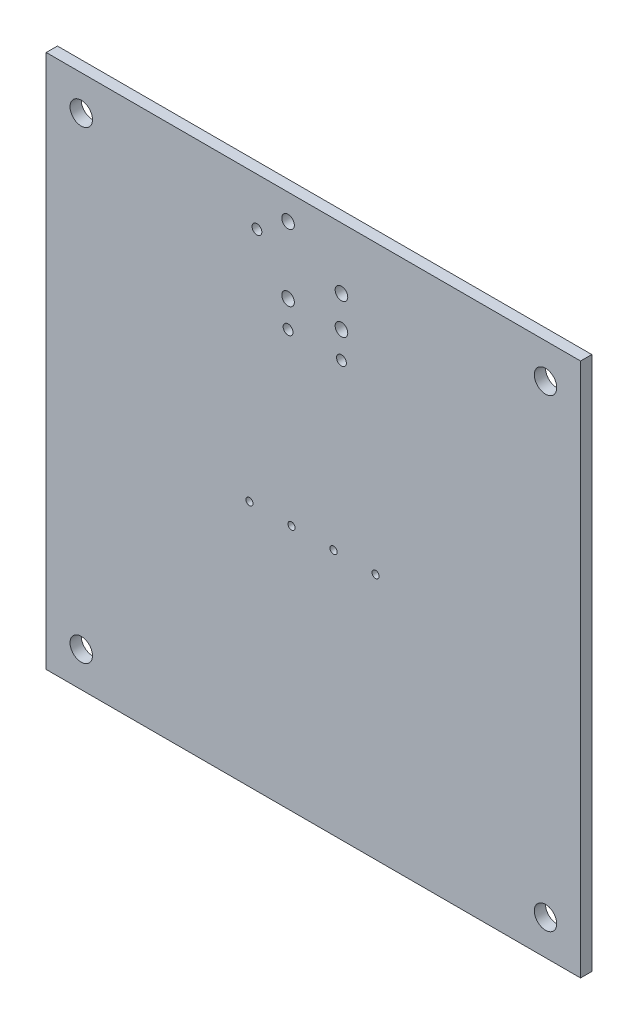
ISO-10303-21;
HEADER;
FILE_DESCRIPTION(('STEP AP214'),'2;1');
FILE_NAME('part.step','',(''),(''),'','','');
FILE_SCHEMA(('AUTOMOTIVE_DESIGN { 1 0 10303 214 1 1 1 1 }'));
ENDSEC;
DATA;
#1=APPLICATION_CONTEXT('core data for automotive mechanical design processes');
#2=APPLICATION_PROTOCOL_DEFINITION('international standard','automotive_design',2000,#1);
#3=PRODUCT_CONTEXT('',#1,'mechanical');
#4=PRODUCT('Part','Part','',(#3));
#5=PRODUCT_RELATED_PRODUCT_CATEGORY('part','',(#4));
#6=PRODUCT_DEFINITION_FORMATION('','',#4);
#7=PRODUCT_DEFINITION_CONTEXT('part definition',#1,'design');
#8=PRODUCT_DEFINITION('design','',#6,#7);
#9=PRODUCT_DEFINITION_SHAPE('','',#8);
#10=(LENGTH_UNIT() NAMED_UNIT(*) SI_UNIT(.MILLI.,.METRE.));
#11=(NAMED_UNIT(*) PLANE_ANGLE_UNIT() SI_UNIT($,.RADIAN.));
#12=(NAMED_UNIT(*) SI_UNIT($,.STERADIAN.) SOLID_ANGLE_UNIT());
#13=UNCERTAINTY_MEASURE_WITH_UNIT(LENGTH_MEASURE(1.E-05),#10,'distance_accuracy_value','');
#14=(GEOMETRIC_REPRESENTATION_CONTEXT(3) GLOBAL_UNCERTAINTY_ASSIGNED_CONTEXT((#13)) GLOBAL_UNIT_ASSIGNED_CONTEXT((#10,
#11,#12)) REPRESENTATION_CONTEXT('',''));
#15=CARTESIAN_POINT('',(0.,0.,0.));
#16=DIRECTION('',(0.,0.,1.));
#17=DIRECTION('',(1.,0.,0.));
#18=AXIS2_PLACEMENT_3D('',#15,#16,#17);
#19=CARTESIAN_POINT('',(5.,-71.25,-0.8));
#20=DIRECTION('',(0.,0.,1.));
#21=DIRECTION('',(1.,0.,0.));
#22=AXIS2_PLACEMENT_3D('',#19,#20,#21);
#23=CYLINDRICAL_SURFACE('',#22,1.6);
#24=DIRECTION('',(0.,0.,1.));
#25=VECTOR('',#24,1.);
#26=CARTESIAN_POINT('',(6.6,-71.25,-0.8));
#27=LINE('',#26,#25);
#28=CARTESIAN_POINT('',(6.6,-71.25,0.));
#29=VERTEX_POINT('',#28);
#30=CARTESIAN_POINT('',(6.6,-71.25,1.6));
#31=VERTEX_POINT('',#30);
#32=EDGE_CURVE('E10',#29,#31,#27,.T.);
#33=ORIENTED_EDGE('',*,*,#32,.F.);
#34=CARTESIAN_POINT('',(5.,-71.25,0.));
#35=DIRECTION('',(0.,0.,1.));
#36=DIRECTION('',(1.,0.,0.));
#37=AXIS2_PLACEMENT_3D('',#34,#35,#36);
#38=CIRCLE('',#37,1.6);
#39=EDGE_CURVE('E228',#29,#29,#38,.T.);
#40=ORIENTED_EDGE('',*,*,#39,.F.);
#41=ORIENTED_EDGE('',*,*,#32,.T.);
#42=CARTESIAN_POINT('',(5.,-71.25,1.6));
#43=DIRECTION('',(0.,0.,1.));
#44=DIRECTION('',(1.,0.,0.));
#45=AXIS2_PLACEMENT_3D('',#42,#43,#44);
#46=CIRCLE('',#45,1.6);
#47=EDGE_CURVE('E242',#31,#31,#46,.T.);
#48=ORIENTED_EDGE('',*,*,#47,.T.);
#49=EDGE_LOOP('',(#33,#40,#41,#48));
#50=FACE_BOUND('',#49,.T.);
#51=ADVANCED_FACE('F16',(#50),#23,.F.);
#52=CARTESIAN_POINT('',(5.,-5.,-0.8));
#53=DIRECTION('',(0.,0.,1.));
#54=DIRECTION('',(1.,0.,0.));
#55=AXIS2_PLACEMENT_3D('',#52,#53,#54);
#56=CYLINDRICAL_SURFACE('',#55,1.6);
#57=DIRECTION('',(0.,0.,1.));
#58=VECTOR('',#57,1.);
#59=CARTESIAN_POINT('',(6.6,-5.,-0.8));
#60=LINE('',#59,#58);
#61=CARTESIAN_POINT('',(6.6,-5.,0.));
#62=VERTEX_POINT('',#61);
#63=CARTESIAN_POINT('',(6.6,-5.,1.6));
#64=VERTEX_POINT('',#63);
#65=EDGE_CURVE('E26',#62,#64,#60,.T.);
#66=ORIENTED_EDGE('',*,*,#65,.F.);
#67=CARTESIAN_POINT('',(5.,-5.,0.));
#68=DIRECTION('',(0.,0.,1.));
#69=DIRECTION('',(1.,0.,0.));
#70=AXIS2_PLACEMENT_3D('',#67,#68,#69);
#71=CIRCLE('',#70,1.6);
#72=EDGE_CURVE('E232',#62,#62,#71,.T.);
#73=ORIENTED_EDGE('',*,*,#72,.F.);
#74=ORIENTED_EDGE('',*,*,#65,.T.);
#75=CARTESIAN_POINT('',(5.,-5.,1.6));
#76=DIRECTION('',(0.,0.,1.));
#77=DIRECTION('',(1.,0.,0.));
#78=AXIS2_PLACEMENT_3D('',#75,#76,#77);
#79=CIRCLE('',#78,1.6);
#80=EDGE_CURVE('E252',#64,#64,#79,.T.);
#81=ORIENTED_EDGE('',*,*,#80,.T.);
#82=EDGE_LOOP('',(#66,#73,#74,#81));
#83=FACE_BOUND('',#82,.T.);
#84=ADVANCED_FACE('F469',(#83),#56,.F.);
#85=CARTESIAN_POINT('',(71.25,-71.25,-0.8));
#86=DIRECTION('',(0.,0.,1.));
#87=DIRECTION('',(1.,0.,0.));
#88=AXIS2_PLACEMENT_3D('',#85,#86,#87);
#89=CYLINDRICAL_SURFACE('',#88,1.6);
#90=DIRECTION('',(0.,0.,1.));
#91=VECTOR('',#90,1.);
#92=CARTESIAN_POINT('',(72.85,-71.25,-0.8));
#93=LINE('',#92,#91);
#94=CARTESIAN_POINT('',(72.85,-71.25,0.));
#95=VERTEX_POINT('',#94);
#96=CARTESIAN_POINT('',(72.85,-71.25,1.6));
#97=VERTEX_POINT('',#96);
#98=EDGE_CURVE('E212',#95,#97,#93,.T.);
#99=ORIENTED_EDGE('',*,*,#98,.F.);
#100=CARTESIAN_POINT('',(71.25,-71.25,0.));
#101=DIRECTION('',(0.,0.,1.));
#102=DIRECTION('',(1.,0.,0.));
#103=AXIS2_PLACEMENT_3D('',#100,#101,#102);
#104=CIRCLE('',#103,1.6);
#105=EDGE_CURVE('E299',#95,#95,#104,.T.);
#106=ORIENTED_EDGE('',*,*,#105,.F.);
#107=ORIENTED_EDGE('',*,*,#98,.T.);
#108=CARTESIAN_POINT('',(71.25,-71.25,1.6));
#109=DIRECTION('',(0.,0.,1.));
#110=DIRECTION('',(1.,0.,0.));
#111=AXIS2_PLACEMENT_3D('',#108,#109,#110);
#112=CIRCLE('',#111,1.6);
#113=EDGE_CURVE('E238',#97,#97,#112,.T.);
#114=ORIENTED_EDGE('',*,*,#113,.T.);
#115=EDGE_LOOP('',(#99,#106,#107,#114));
#116=FACE_BOUND('',#115,.T.);
#117=ADVANCED_FACE('F475',(#116),#89,.F.);
#118=CARTESIAN_POINT('',(71.25,-5.,-0.8));
#119=DIRECTION('',(0.,0.,1.));
#120=DIRECTION('',(1.,0.,0.));
#121=AXIS2_PLACEMENT_3D('',#118,#119,#120);
#122=CYLINDRICAL_SURFACE('',#121,1.6);
#123=DIRECTION('',(0.,0.,1.));
#124=VECTOR('',#123,1.);
#125=CARTESIAN_POINT('',(72.85,-5.,-0.8));
#126=LINE('',#125,#124);
#127=CARTESIAN_POINT('',(72.85,-5.,0.));
#128=VERTEX_POINT('',#127);
#129=CARTESIAN_POINT('',(72.85,-5.,1.6));
#130=VERTEX_POINT('',#129);
#131=EDGE_CURVE('E214',#128,#130,#126,.T.);
#132=ORIENTED_EDGE('',*,*,#131,.F.);
#133=CARTESIAN_POINT('',(71.25,-5.,0.));
#134=DIRECTION('',(0.,0.,1.));
#135=DIRECTION('',(1.,0.,0.));
#136=AXIS2_PLACEMENT_3D('',#133,#134,#135);
#137=CIRCLE('',#136,1.6);
#138=EDGE_CURVE('E278',#128,#128,#137,.T.);
#139=ORIENTED_EDGE('',*,*,#138,.F.);
#140=ORIENTED_EDGE('',*,*,#131,.T.);
#141=CARTESIAN_POINT('',(71.25,-5.,1.6));
#142=DIRECTION('',(0.,0.,1.));
#143=DIRECTION('',(1.,0.,0.));
#144=AXIS2_PLACEMENT_3D('',#141,#142,#143);
#145=CIRCLE('',#144,1.6);
#146=EDGE_CURVE('E222',#130,#130,#145,.T.);
#147=ORIENTED_EDGE('',*,*,#146,.T.);
#148=EDGE_LOOP('',(#132,#139,#140,#147));
#149=FACE_BOUND('',#148,.T.);
#150=ADVANCED_FACE('F485',(#149),#122,.F.);
#151=CARTESIAN_POINT('',(47.,-41.,-0.8));
#152=DIRECTION('',(0.,0.,1.));
#153=DIRECTION('',(1.,0.,0.));
#154=AXIS2_PLACEMENT_3D('',#151,#152,#153);
#155=CYLINDRICAL_SURFACE('',#154,0.51);
#156=DIRECTION('',(0.,0.,1.));
#157=VECTOR('',#156,1.);
#158=CARTESIAN_POINT('',(47.51,-41.,-0.8));
#159=LINE('',#158,#157);
#160=CARTESIAN_POINT('',(47.51,-41.,0.));
#161=VERTEX_POINT('',#160);
#162=CARTESIAN_POINT('',(47.51,-41.,1.6));
#163=VERTEX_POINT('',#162);
#164=EDGE_CURVE('E315',#161,#163,#159,.T.);
#165=ORIENTED_EDGE('',*,*,#164,.F.);
#166=CARTESIAN_POINT('',(47.,-41.,0.));
#167=DIRECTION('',(0.,0.,1.));
#168=DIRECTION('',(1.,0.,0.));
#169=AXIS2_PLACEMENT_3D('',#166,#167,#168);
#170=CIRCLE('',#169,0.51);
#171=EDGE_CURVE('E274',#161,#161,#170,.T.);
#172=ORIENTED_EDGE('',*,*,#171,.F.);
#173=ORIENTED_EDGE('',*,*,#164,.T.);
#174=CARTESIAN_POINT('',(47.,-41.,1.6));
#175=DIRECTION('',(0.,0.,1.));
#176=DIRECTION('',(1.,0.,0.));
#177=AXIS2_PLACEMENT_3D('',#174,#175,#176);
#178=CIRCLE('',#177,0.51);
#179=EDGE_CURVE('E227',#163,#163,#178,.T.);
#180=ORIENTED_EDGE('',*,*,#179,.T.);
#181=EDGE_LOOP('',(#165,#172,#173,#180));
#182=FACE_BOUND('',#181,.T.);
#183=ADVANCED_FACE('F483',(#182),#155,.F.);
#184=CARTESIAN_POINT('',(30.07,-6.815,-0.8));
#185=DIRECTION('',(0.,0.,1.));
#186=DIRECTION('',(1.,0.,0.));
#187=AXIS2_PLACEMENT_3D('',#184,#185,#186);
#188=CYLINDRICAL_SURFACE('',#187,0.7);
#189=DIRECTION('',(0.,0.,1.));
#190=VECTOR('',#189,1.);
#191=CARTESIAN_POINT('',(30.77,-6.815,-0.8));
#192=LINE('',#191,#190);
#193=CARTESIAN_POINT('',(30.77,-6.815,0.));
#194=VERTEX_POINT('',#193);
#195=CARTESIAN_POINT('',(30.77,-6.815,1.6));
#196=VERTEX_POINT('',#195);
#197=EDGE_CURVE('E291',#194,#196,#192,.T.);
#198=ORIENTED_EDGE('',*,*,#197,.F.);
#199=CARTESIAN_POINT('',(30.07,-6.815,0.));
#200=DIRECTION('',(0.,0.,1.));
#201=DIRECTION('',(1.,0.,0.));
#202=AXIS2_PLACEMENT_3D('',#199,#200,#201);
#203=CIRCLE('',#202,0.7);
#204=EDGE_CURVE('E279',#194,#194,#203,.T.);
#205=ORIENTED_EDGE('',*,*,#204,.F.);
#206=ORIENTED_EDGE('',*,*,#197,.T.);
#207=CARTESIAN_POINT('',(30.07,-6.815,1.6));
#208=DIRECTION('',(0.,0.,1.));
#209=DIRECTION('',(1.,0.,0.));
#210=AXIS2_PLACEMENT_3D('',#207,#208,#209);
#211=CIRCLE('',#210,0.7);
#212=EDGE_CURVE('E308',#196,#196,#211,.T.);
#213=ORIENTED_EDGE('',*,*,#212,.T.);
#214=EDGE_LOOP('',(#198,#205,#206,#213));
#215=FACE_BOUND('',#214,.T.);
#216=ADVANCED_FACE('F382',(#215),#188,.F.);
#217=CARTESIAN_POINT('',(34.51,-3.645,-0.8));
#218=DIRECTION('',(0.,0.,1.));
#219=DIRECTION('',(1.,0.,0.));
#220=AXIS2_PLACEMENT_3D('',#217,#218,#219);
#221=CYLINDRICAL_SURFACE('',#220,0.9);
#222=DIRECTION('',(0.,0.,1.));
#223=VECTOR('',#222,1.);
#224=CARTESIAN_POINT('',(35.41,-3.645,-0.8));
#225=LINE('',#224,#223);
#226=CARTESIAN_POINT('',(35.41,-3.645,0.));
#227=VERTEX_POINT('',#226);
#228=CARTESIAN_POINT('',(35.41,-3.645,1.6));
#229=VERTEX_POINT('',#228);
#230=EDGE_CURVE('E153',#227,#229,#225,.T.);
#231=ORIENTED_EDGE('',*,*,#230,.F.);
#232=CARTESIAN_POINT('',(34.51,-3.645,0.));
#233=DIRECTION('',(0.,0.,1.));
#234=DIRECTION('',(1.,0.,0.));
#235=AXIS2_PLACEMENT_3D('',#232,#233,#234);
#236=CIRCLE('',#235,0.9);
#237=EDGE_CURVE('E351',#227,#227,#236,.T.);
#238=ORIENTED_EDGE('',*,*,#237,.F.);
#239=ORIENTED_EDGE('',*,*,#230,.T.);
#240=CARTESIAN_POINT('',(34.51,-3.645,1.6));
#241=DIRECTION('',(0.,0.,1.));
#242=DIRECTION('',(1.,0.,0.));
#243=AXIS2_PLACEMENT_3D('',#240,#241,#242);
#244=CIRCLE('',#243,0.9);
#245=EDGE_CURVE('E257',#229,#229,#244,.T.);
#246=ORIENTED_EDGE('',*,*,#245,.T.);
#247=EDGE_LOOP('',(#231,#238,#239,#246));
#248=FACE_BOUND('',#247,.T.);
#249=ADVANCED_FACE('F492',(#248),#221,.F.);
#250=CARTESIAN_POINT('',(41.,-41.,-0.8));
#251=DIRECTION('',(0.,0.,1.));
#252=DIRECTION('',(1.,0.,0.));
#253=AXIS2_PLACEMENT_3D('',#250,#251,#252);
#254=CYLINDRICAL_SURFACE('',#253,0.51);
#255=DIRECTION('',(0.,0.,1.));
#256=VECTOR('',#255,1.);
#257=CARTESIAN_POINT('',(41.51,-41.,-0.8));
#258=LINE('',#257,#256);
#259=CARTESIAN_POINT('',(41.51,-41.,0.));
#260=VERTEX_POINT('',#259);
#261=CARTESIAN_POINT('',(41.51,-41.,1.6));
#262=VERTEX_POINT('',#261);
#263=EDGE_CURVE('E168',#260,#262,#258,.T.);
#264=ORIENTED_EDGE('',*,*,#263,.F.);
#265=CARTESIAN_POINT('',(41.,-41.,0.));
#266=DIRECTION('',(0.,0.,1.));
#267=DIRECTION('',(1.,0.,0.));
#268=AXIS2_PLACEMENT_3D('',#265,#266,#267);
#269=CIRCLE('',#268,0.51);
#270=EDGE_CURVE('E202',#260,#260,#269,.T.);
#271=ORIENTED_EDGE('',*,*,#270,.F.);
#272=ORIENTED_EDGE('',*,*,#263,.T.);
#273=CARTESIAN_POINT('',(41.,-41.,1.6));
#274=DIRECTION('',(0.,0.,1.));
#275=DIRECTION('',(1.,0.,0.));
#276=AXIS2_PLACEMENT_3D('',#273,#274,#275);
#277=CIRCLE('',#276,0.51);
#278=EDGE_CURVE('E312',#262,#262,#277,.T.);
#279=ORIENTED_EDGE('',*,*,#278,.T.);
#280=EDGE_LOOP('',(#264,#271,#272,#279));
#281=FACE_BOUND('',#280,.T.);
#282=ADVANCED_FACE('F448',(#281),#254,.F.);
#283=CARTESIAN_POINT('',(35.,-41.,-0.8));
#284=DIRECTION('',(0.,0.,1.));
#285=DIRECTION('',(1.,0.,0.));
#286=AXIS2_PLACEMENT_3D('',#283,#284,#285);
#287=CYLINDRICAL_SURFACE('',#286,0.51);
#288=DIRECTION('',(0.,0.,1.));
#289=VECTOR('',#288,1.);
#290=CARTESIAN_POINT('',(35.51,-41.,-0.8));
#291=LINE('',#290,#289);
#292=CARTESIAN_POINT('',(35.51,-41.,0.));
#293=VERTEX_POINT('',#292);
#294=CARTESIAN_POINT('',(35.51,-41.,1.6));
#295=VERTEX_POINT('',#294);
#296=EDGE_CURVE('E187',#293,#295,#291,.T.);
#297=ORIENTED_EDGE('',*,*,#296,.F.);
#298=CARTESIAN_POINT('',(35.,-41.,0.));
#299=DIRECTION('',(0.,0.,1.));
#300=DIRECTION('',(1.,0.,0.));
#301=AXIS2_PLACEMENT_3D('',#298,#299,#300);
#302=CIRCLE('',#301,0.51);
#303=EDGE_CURVE('E194',#293,#293,#302,.T.);
#304=ORIENTED_EDGE('',*,*,#303,.F.);
#305=ORIENTED_EDGE('',*,*,#296,.T.);
#306=CARTESIAN_POINT('',(35.,-41.,1.6));
#307=DIRECTION('',(0.,0.,1.));
#308=DIRECTION('',(1.,0.,0.));
#309=AXIS2_PLACEMENT_3D('',#306,#307,#308);
#310=CIRCLE('',#309,0.51);
#311=EDGE_CURVE('E19',#295,#295,#310,.T.);
#312=ORIENTED_EDGE('',*,*,#311,.T.);
#313=EDGE_LOOP('',(#297,#304,#305,#312));
#314=FACE_BOUND('',#313,.T.);
#315=ADVANCED_FACE('F456',(#314),#287,.F.);
#316=CARTESIAN_POINT('',(29.,-41.,-0.8));
#317=DIRECTION('',(0.,0.,1.));
#318=DIRECTION('',(1.,0.,0.));
#319=AXIS2_PLACEMENT_3D('',#316,#317,#318);
#320=CYLINDRICAL_SURFACE('',#319,0.51);
#321=DIRECTION('',(0.,0.,1.));
#322=VECTOR('',#321,1.);
#323=CARTESIAN_POINT('',(29.51,-41.,-0.8));
#324=LINE('',#323,#322);
#325=CARTESIAN_POINT('',(29.51,-41.,0.));
#326=VERTEX_POINT('',#325);
#327=CARTESIAN_POINT('',(29.51,-41.,1.6));
#328=VERTEX_POINT('',#327);
#329=EDGE_CURVE('E180',#326,#328,#324,.T.);
#330=ORIENTED_EDGE('',*,*,#329,.F.);
#331=CARTESIAN_POINT('',(29.,-41.,0.));
#332=DIRECTION('',(0.,0.,1.));
#333=DIRECTION('',(1.,0.,0.));
#334=AXIS2_PLACEMENT_3D('',#331,#332,#333);
#335=CIRCLE('',#334,0.51);
#336=EDGE_CURVE('E183',#326,#326,#335,.T.);
#337=ORIENTED_EDGE('',*,*,#336,.F.);
#338=ORIENTED_EDGE('',*,*,#329,.T.);
#339=CARTESIAN_POINT('',(29.,-41.,1.6));
#340=DIRECTION('',(0.,0.,1.));
#341=DIRECTION('',(1.,0.,0.));
#342=AXIS2_PLACEMENT_3D('',#339,#340,#341);
#343=CIRCLE('',#342,0.51);
#344=EDGE_CURVE('E185',#328,#328,#343,.T.);
#345=ORIENTED_EDGE('',*,*,#344,.T.);
#346=EDGE_LOOP('',(#330,#337,#338,#345));
#347=FACE_BOUND('',#346,.T.);
#348=ADVANCED_FACE('F182',(#347),#320,.F.);
#349=CARTESIAN_POINT('',(34.51,-13.17,-0.8));
#350=DIRECTION('',(0.,0.,1.));
#351=DIRECTION('',(1.,0.,0.));
#352=AXIS2_PLACEMENT_3D('',#349,#350,#351);
#353=CYLINDRICAL_SURFACE('',#352,0.9);
#354=DIRECTION('',(0.,0.,1.));
#355=VECTOR('',#354,1.);
#356=CARTESIAN_POINT('',(35.41,-13.17,-0.8));
#357=LINE('',#356,#355);
#358=CARTESIAN_POINT('',(35.41,-13.17,0.));
#359=VERTEX_POINT('',#358);
#360=CARTESIAN_POINT('',(35.41,-13.17,1.6));
#361=VERTEX_POINT('',#360);
#362=EDGE_CURVE('E188',#359,#361,#357,.T.);
#363=ORIENTED_EDGE('',*,*,#362,.F.);
#364=CARTESIAN_POINT('',(34.51,-13.17,0.));
#365=DIRECTION('',(0.,0.,1.));
#366=DIRECTION('',(1.,0.,0.));
#367=AXIS2_PLACEMENT_3D('',#364,#365,#366);
#368=CIRCLE('',#367,0.9);
#369=EDGE_CURVE('E195',#359,#359,#368,.T.);
#370=ORIENTED_EDGE('',*,*,#369,.F.);
#371=ORIENTED_EDGE('',*,*,#362,.T.);
#372=CARTESIAN_POINT('',(34.51,-13.17,1.6));
#373=DIRECTION('',(0.,0.,1.));
#374=DIRECTION('',(1.,0.,0.));
#375=AXIS2_PLACEMENT_3D('',#372,#373,#374);
#376=CIRCLE('',#375,0.9);
#377=EDGE_CURVE('E258',#361,#361,#376,.T.);
#378=ORIENTED_EDGE('',*,*,#377,.T.);
#379=EDGE_LOOP('',(#363,#370,#371,#378));
#380=FACE_BOUND('',#379,.T.);
#381=ADVANCED_FACE('F523',(#380),#353,.F.);
#382=CARTESIAN_POINT('',(34.51,-16.985,-0.8));
#383=DIRECTION('',(0.,0.,1.));
#384=DIRECTION('',(1.,0.,0.));
#385=AXIS2_PLACEMENT_3D('',#382,#383,#384);
#386=CYLINDRICAL_SURFACE('',#385,0.7);
#387=DIRECTION('',(0.,0.,1.));
#388=VECTOR('',#387,1.);
#389=CARTESIAN_POINT('',(35.21,-16.985,-0.8));
#390=LINE('',#389,#388);
#391=CARTESIAN_POINT('',(35.21,-16.985,0.));
#392=VERTEX_POINT('',#391);
#393=CARTESIAN_POINT('',(35.21,-16.985,1.6));
#394=VERTEX_POINT('',#393);
#395=EDGE_CURVE('E283',#392,#394,#390,.T.);
#396=ORIENTED_EDGE('',*,*,#395,.F.);
#397=CARTESIAN_POINT('',(34.51,-16.985,0.));
#398=DIRECTION('',(0.,0.,1.));
#399=DIRECTION('',(1.,0.,0.));
#400=AXIS2_PLACEMENT_3D('',#397,#398,#399);
#401=CIRCLE('',#400,0.7);
#402=EDGE_CURVE('E206',#392,#392,#401,.T.);
#403=ORIENTED_EDGE('',*,*,#402,.F.);
#404=ORIENTED_EDGE('',*,*,#395,.T.);
#405=CARTESIAN_POINT('',(34.51,-16.985,1.6));
#406=DIRECTION('',(0.,0.,1.));
#407=DIRECTION('',(1.,0.,0.));
#408=AXIS2_PLACEMENT_3D('',#405,#406,#407);
#409=CIRCLE('',#408,0.7);
#410=EDGE_CURVE('E253',#394,#394,#409,.T.);
#411=ORIENTED_EDGE('',*,*,#410,.T.);
#412=EDGE_LOOP('',(#396,#403,#404,#411));
#413=FACE_BOUND('',#412,.T.);
#414=ADVANCED_FACE('F511',(#413),#386,.F.);
#415=CARTESIAN_POINT('',(42.13,-13.17,-0.8));
#416=DIRECTION('',(0.,0.,1.));
#417=DIRECTION('',(1.,0.,0.));
#418=AXIS2_PLACEMENT_3D('',#415,#416,#417);
#419=CYLINDRICAL_SURFACE('',#418,0.9);
#420=DIRECTION('',(0.,0.,1.));
#421=VECTOR('',#420,1.);
#422=CARTESIAN_POINT('',(43.03,-13.17,-0.8));
#423=LINE('',#422,#421);
#424=CARTESIAN_POINT('',(43.03,-13.17,0.));
#425=VERTEX_POINT('',#424);
#426=CARTESIAN_POINT('',(43.03,-13.17,1.6));
#427=VERTEX_POINT('',#426);
#428=EDGE_CURVE('E266',#425,#427,#423,.T.);
#429=ORIENTED_EDGE('',*,*,#428,.F.);
#430=CARTESIAN_POINT('',(42.13,-13.17,0.));
#431=DIRECTION('',(0.,0.,1.));
#432=DIRECTION('',(1.,0.,0.));
#433=AXIS2_PLACEMENT_3D('',#430,#431,#432);
#434=CIRCLE('',#433,0.9);
#435=EDGE_CURVE('E247',#425,#425,#434,.T.);
#436=ORIENTED_EDGE('',*,*,#435,.F.);
#437=ORIENTED_EDGE('',*,*,#428,.T.);
#438=CARTESIAN_POINT('',(42.13,-13.17,1.6));
#439=DIRECTION('',(0.,0.,1.));
#440=DIRECTION('',(1.,0.,0.));
#441=AXIS2_PLACEMENT_3D('',#438,#439,#440);
#442=CIRCLE('',#441,0.9);
#443=EDGE_CURVE('E262',#427,#427,#442,.T.);
#444=ORIENTED_EDGE('',*,*,#443,.T.);
#445=EDGE_LOOP('',(#429,#436,#437,#444));
#446=FACE_BOUND('',#445,.T.);
#447=ADVANCED_FACE('F509',(#446),#419,.F.);
#448=CARTESIAN_POINT('',(42.13,-16.985,-0.8));
#449=DIRECTION('',(0.,0.,1.));
#450=DIRECTION('',(1.,0.,0.));
#451=AXIS2_PLACEMENT_3D('',#448,#449,#450);
#452=CYLINDRICAL_SURFACE('',#451,0.7);
#453=DIRECTION('',(0.,0.,1.));
#454=VECTOR('',#453,1.);
#455=CARTESIAN_POINT('',(42.83,-16.985,-0.8));
#456=LINE('',#455,#454);
#457=CARTESIAN_POINT('',(42.83,-16.985,0.));
#458=VERTEX_POINT('',#457);
#459=CARTESIAN_POINT('',(42.83,-16.985,1.6));
#460=VERTEX_POINT('',#459);
#461=EDGE_CURVE('E251',#458,#460,#456,.T.);
#462=ORIENTED_EDGE('',*,*,#461,.F.);
#463=CARTESIAN_POINT('',(42.13,-16.985,0.));
#464=DIRECTION('',(0.,0.,1.));
#465=DIRECTION('',(1.,0.,0.));
#466=AXIS2_PLACEMENT_3D('',#463,#464,#465);
#467=CIRCLE('',#466,0.7);
#468=EDGE_CURVE('E327',#458,#458,#467,.T.);
#469=ORIENTED_EDGE('',*,*,#468,.F.);
#470=ORIENTED_EDGE('',*,*,#461,.T.);
#471=CARTESIAN_POINT('',(42.13,-16.985,1.6));
#472=DIRECTION('',(0.,0.,1.));
#473=DIRECTION('',(1.,0.,0.));
#474=AXIS2_PLACEMENT_3D('',#471,#472,#473);
#475=CIRCLE('',#474,0.7);
#476=EDGE_CURVE('E243',#460,#460,#475,.T.);
#477=ORIENTED_EDGE('',*,*,#476,.T.);
#478=EDGE_LOOP('',(#462,#469,#470,#477));
#479=FACE_BOUND('',#478,.T.);
#480=ADVANCED_FACE('F435',(#479),#452,.F.);
#481=CARTESIAN_POINT('',(42.13,-8.725,-0.8));
#482=DIRECTION('',(0.,0.,1.));
#483=DIRECTION('',(1.,0.,0.));
#484=AXIS2_PLACEMENT_3D('',#481,#482,#483);
#485=CYLINDRICAL_SURFACE('',#484,0.9);
#486=DIRECTION('',(0.,0.,1.));
#487=VECTOR('',#486,1.);
#488=CARTESIAN_POINT('',(43.03,-8.725,-0.8));
#489=LINE('',#488,#487);
#490=CARTESIAN_POINT('',(43.03,-8.725,0.));
#491=VERTEX_POINT('',#490);
#492=CARTESIAN_POINT('',(43.03,-8.725,1.6));
#493=VERTEX_POINT('',#492);
#494=EDGE_CURVE('E248',#491,#493,#489,.T.);
#495=ORIENTED_EDGE('',*,*,#494,.F.);
#496=CARTESIAN_POINT('',(42.13,-8.725,0.));
#497=DIRECTION('',(0.,0.,1.));
#498=DIRECTION('',(1.,0.,0.));
#499=AXIS2_PLACEMENT_3D('',#496,#497,#498);
#500=CIRCLE('',#499,0.9);
#501=EDGE_CURVE('E294',#491,#491,#500,.T.);
#502=ORIENTED_EDGE('',*,*,#501,.F.);
#503=ORIENTED_EDGE('',*,*,#494,.T.);
#504=CARTESIAN_POINT('',(42.13,-8.725,1.6));
#505=DIRECTION('',(0.,0.,1.));
#506=DIRECTION('',(1.,0.,0.));
#507=AXIS2_PLACEMENT_3D('',#504,#505,#506);
#508=CIRCLE('',#507,0.9);
#509=EDGE_CURVE('E226',#493,#493,#508,.T.);
#510=ORIENTED_EDGE('',*,*,#509,.T.);
#511=EDGE_LOOP('',(#495,#502,#503,#510));
#512=FACE_BOUND('',#511,.T.);
#513=ADVANCED_FACE('F520',(#512),#485,.F.);
#514=CARTESIAN_POINT('',(0.,-76.25,0.));
#515=DIRECTION('',(0.,1.,0.));
#516=DIRECTION('',(1.,0.,0.));
#517=AXIS2_PLACEMENT_3D('',#514,#515,#516);
#518=PLANE('',#517);
#519=DIRECTION('',(1.,0.,0.));
#520=VECTOR('',#519,1.);
#521=CARTESIAN_POINT('',(0.,-76.25,0.));
#522=LINE('',#521,#520);
#523=CARTESIAN_POINT('',(0.,-76.25,0.));
#524=VERTEX_POINT('',#523);
#525=CARTESIAN_POINT('',(76.25,-76.25,0.));
#526=VERTEX_POINT('',#525);
#527=EDGE_CURVE('E133',#524,#526,#522,.T.);
#528=ORIENTED_EDGE('',*,*,#527,.T.);
#529=DIRECTION('',(0.,0.,1.));
#530=VECTOR('',#529,1.);
#531=CARTESIAN_POINT('',(76.25,-76.25,0.));
#532=LINE('',#531,#530);
#533=CARTESIAN_POINT('',(76.25,-76.25,1.6));
#534=VERTEX_POINT('',#533);
#535=EDGE_CURVE('E307',#526,#534,#532,.T.);
#536=ORIENTED_EDGE('',*,*,#535,.T.);
#537=DIRECTION('',(1.,0.,0.));
#538=VECTOR('',#537,1.);
#539=CARTESIAN_POINT('',(0.,-76.25,1.6));
#540=LINE('',#539,#538);
#541=CARTESIAN_POINT('',(0.,-76.25,1.6));
#542=VERTEX_POINT('',#541);
#543=EDGE_CURVE('E121',#542,#534,#540,.T.);
#544=ORIENTED_EDGE('',*,*,#543,.F.);
#545=DIRECTION('',(0.,0.,1.));
#546=VECTOR('',#545,1.);
#547=CARTESIAN_POINT('',(0.,-76.25,0.));
#548=LINE('',#547,#546);
#549=EDGE_CURVE('E306',#524,#542,#548,.T.);
#550=ORIENTED_EDGE('',*,*,#549,.F.);
#551=EDGE_LOOP('',(#528,#536,#544,#550));
#552=FACE_BOUND('',#551,.T.);
#553=ADVANCED_FACE('F388',(#552),#518,.F.);
#554=CARTESIAN_POINT('',(38.125,-38.125,1.6));
#555=DIRECTION('',(0.,0.,1.));
#556=DIRECTION('',(1.,0.,0.));
#557=AXIS2_PLACEMENT_3D('',#554,#555,#556);
#558=PLANE('',#557);
#559=ORIENTED_EDGE('',*,*,#80,.F.);
#560=EDGE_LOOP('',(#559));
#561=FACE_BOUND('',#560,.T.);
#562=ORIENTED_EDGE('',*,*,#47,.F.);
#563=EDGE_LOOP('',(#562));
#564=FACE_BOUND('',#563,.T.);
#565=ORIENTED_EDGE('',*,*,#113,.F.);
#566=EDGE_LOOP('',(#565));
#567=FACE_BOUND('',#566,.T.);
#568=ORIENTED_EDGE('',*,*,#476,.F.);
#569=EDGE_LOOP('',(#568));
#570=FACE_BOUND('',#569,.T.);
#571=ORIENTED_EDGE('',*,*,#443,.F.);
#572=EDGE_LOOP('',(#571));
#573=FACE_BOUND('',#572,.T.);
#574=ORIENTED_EDGE('',*,*,#509,.F.);
#575=EDGE_LOOP('',(#574));
#576=FACE_BOUND('',#575,.T.);
#577=ORIENTED_EDGE('',*,*,#146,.F.);
#578=EDGE_LOOP('',(#577));
#579=FACE_BOUND('',#578,.T.);
#580=ORIENTED_EDGE('',*,*,#179,.F.);
#581=EDGE_LOOP('',(#580));
#582=FACE_BOUND('',#581,.T.);
#583=ORIENTED_EDGE('',*,*,#278,.F.);
#584=EDGE_LOOP('',(#583));
#585=FACE_BOUND('',#584,.T.);
#586=ORIENTED_EDGE('',*,*,#212,.F.);
#587=EDGE_LOOP('',(#586));
#588=FACE_BOUND('',#587,.T.);
#589=ORIENTED_EDGE('',*,*,#245,.F.);
#590=EDGE_LOOP('',(#589));
#591=FACE_BOUND('',#590,.T.);
#592=ORIENTED_EDGE('',*,*,#410,.F.);
#593=EDGE_LOOP('',(#592));
#594=FACE_BOUND('',#593,.T.);
#595=ORIENTED_EDGE('',*,*,#377,.F.);
#596=EDGE_LOOP('',(#595));
#597=FACE_BOUND('',#596,.T.);
#598=ORIENTED_EDGE('',*,*,#311,.F.);
#599=EDGE_LOOP('',(#598));
#600=FACE_BOUND('',#599,.T.);
#601=ORIENTED_EDGE('',*,*,#344,.F.);
#602=EDGE_LOOP('',(#601));
#603=FACE_BOUND('',#602,.T.);
#604=DIRECTION('',(-1.,0.,0.));
#605=VECTOR('',#604,1.);
#606=CARTESIAN_POINT('',(76.25,0.,1.6));
#607=LINE('',#606,#605);
#608=CARTESIAN_POINT('',(76.25,0.,1.6));
#609=VERTEX_POINT('',#608);
#610=CARTESIAN_POINT('',(0.,0.,1.6));
#611=VERTEX_POINT('',#610);
#612=EDGE_CURVE('E270',#609,#611,#607,.T.);
#613=ORIENTED_EDGE('',*,*,#612,.T.);
#614=DIRECTION('',(0.,-1.,0.));
#615=VECTOR('',#614,1.);
#616=CARTESIAN_POINT('',(0.,0.,1.6));
#617=LINE('',#616,#615);
#618=EDGE_CURVE('E295',#611,#542,#617,.T.);
#619=ORIENTED_EDGE('',*,*,#618,.T.);
#620=ORIENTED_EDGE('',*,*,#543,.T.);
#621=DIRECTION('',(0.,1.,0.));
#622=VECTOR('',#621,1.);
#623=CARTESIAN_POINT('',(76.25,-76.25,1.6));
#624=LINE('',#623,#622);
#625=EDGE_CURVE('E220',#534,#609,#624,.T.);
#626=ORIENTED_EDGE('',*,*,#625,.T.);
#627=EDGE_LOOP('',(#613,#619,#620,#626));
#628=FACE_BOUND('',#627,.T.);
#629=ADVANCED_FACE('F385',(#561,#564,#567,#570,#573,#576,#579,#582,#585,#588,#591,#594,#597,
#600,#603,#628),#558,.T.);
#630=CARTESIAN_POINT('',(38.125,-38.125,0.));
#631=DIRECTION('',(0.,0.,1.));
#632=DIRECTION('',(1.,0.,0.));
#633=AXIS2_PLACEMENT_3D('',#630,#631,#632);
#634=PLANE('',#633);
#635=ORIENTED_EDGE('',*,*,#39,.T.);
#636=EDGE_LOOP('',(#635));
#637=FACE_BOUND('',#636,.T.);
#638=ORIENTED_EDGE('',*,*,#72,.T.);
#639=EDGE_LOOP('',(#638));
#640=FACE_BOUND('',#639,.T.);
#641=ORIENTED_EDGE('',*,*,#105,.T.);
#642=EDGE_LOOP('',(#641));
#643=FACE_BOUND('',#642,.T.);
#644=ORIENTED_EDGE('',*,*,#138,.T.);
#645=EDGE_LOOP('',(#644));
#646=FACE_BOUND('',#645,.T.);
#647=ORIENTED_EDGE('',*,*,#171,.T.);
#648=EDGE_LOOP('',(#647));
#649=FACE_BOUND('',#648,.T.);
#650=ORIENTED_EDGE('',*,*,#204,.T.);
#651=EDGE_LOOP('',(#650));
#652=FACE_BOUND('',#651,.T.);
#653=ORIENTED_EDGE('',*,*,#237,.T.);
#654=EDGE_LOOP('',(#653));
#655=FACE_BOUND('',#654,.T.);
#656=ORIENTED_EDGE('',*,*,#270,.T.);
#657=EDGE_LOOP('',(#656));
#658=FACE_BOUND('',#657,.T.);
#659=ORIENTED_EDGE('',*,*,#303,.T.);
#660=EDGE_LOOP('',(#659));
#661=FACE_BOUND('',#660,.T.);
#662=ORIENTED_EDGE('',*,*,#336,.T.);
#663=EDGE_LOOP('',(#662));
#664=FACE_BOUND('',#663,.T.);
#665=ORIENTED_EDGE('',*,*,#369,.T.);
#666=EDGE_LOOP('',(#665));
#667=FACE_BOUND('',#666,.T.);
#668=ORIENTED_EDGE('',*,*,#402,.T.);
#669=EDGE_LOOP('',(#668));
#670=FACE_BOUND('',#669,.T.);
#671=ORIENTED_EDGE('',*,*,#435,.T.);
#672=EDGE_LOOP('',(#671));
#673=FACE_BOUND('',#672,.T.);
#674=ORIENTED_EDGE('',*,*,#468,.T.);
#675=EDGE_LOOP('',(#674));
#676=FACE_BOUND('',#675,.T.);
#677=ORIENTED_EDGE('',*,*,#501,.T.);
#678=EDGE_LOOP('',(#677));
#679=FACE_BOUND('',#678,.T.);
#680=DIRECTION('',(0.,1.,0.));
#681=VECTOR('',#680,1.);
#682=CARTESIAN_POINT('',(76.25,-76.25,0.));
#683=LINE('',#682,#681);
#684=CARTESIAN_POINT('',(76.25,0.,0.));
#685=VERTEX_POINT('',#684);
#686=EDGE_CURVE('E216',#526,#685,#683,.T.);
#687=ORIENTED_EDGE('',*,*,#686,.F.);
#688=ORIENTED_EDGE('',*,*,#527,.F.);
#689=DIRECTION('',(0.,-1.,0.));
#690=VECTOR('',#689,1.);
#691=CARTESIAN_POINT('',(0.,0.,0.));
#692=LINE('',#691,#690);
#693=CARTESIAN_POINT('',(0.,0.,0.));
#694=VERTEX_POINT('',#693);
#695=EDGE_CURVE('E302',#694,#524,#692,.T.);
#696=ORIENTED_EDGE('',*,*,#695,.F.);
#697=DIRECTION('',(-1.,0.,0.));
#698=VECTOR('',#697,1.);
#699=CARTESIAN_POINT('',(76.25,0.,0.));
#700=LINE('',#699,#698);
#701=EDGE_CURVE('E233',#685,#694,#700,.T.);
#702=ORIENTED_EDGE('',*,*,#701,.F.);
#703=EDGE_LOOP('',(#687,#688,#696,#702));
#704=FACE_BOUND('',#703,.T.);
#705=ADVANCED_FACE('F191',(#637,#640,#643,#646,#649,#652,#655,#658,#661,#664,#667,#670,#673,
#676,#679,#704),#634,.F.);
#706=CARTESIAN_POINT('',(0.,0.,0.));
#707=DIRECTION('',(1.,0.,0.));
#708=DIRECTION('',(0.,1.,0.));
#709=AXIS2_PLACEMENT_3D('',#706,#707,#708);
#710=PLANE('',#709);
#711=ORIENTED_EDGE('',*,*,#695,.T.);
#712=ORIENTED_EDGE('',*,*,#549,.T.);
#713=ORIENTED_EDGE('',*,*,#618,.F.);
#714=DIRECTION('',(0.,0.,1.));
#715=VECTOR('',#714,1.);
#716=CARTESIAN_POINT('',(0.,0.,0.));
#717=LINE('',#716,#715);
#718=EDGE_CURVE('E237',#694,#611,#717,.T.);
#719=ORIENTED_EDGE('',*,*,#718,.F.);
#720=EDGE_LOOP('',(#711,#712,#713,#719));
#721=FACE_BOUND('',#720,.T.);
#722=ADVANCED_FACE('F413',(#721),#710,.F.);
#723=CARTESIAN_POINT('',(76.25,-76.25,0.));
#724=DIRECTION('',(-1.,0.,0.));
#725=DIRECTION('',(0.,0.,1.));
#726=AXIS2_PLACEMENT_3D('',#723,#724,#725);
#727=PLANE('',#726);
#728=ORIENTED_EDGE('',*,*,#686,.T.);
#729=DIRECTION('',(0.,0.,1.));
#730=VECTOR('',#729,1.);
#731=CARTESIAN_POINT('',(76.25,0.,0.));
#732=LINE('',#731,#730);
#733=EDGE_CURVE('E221',#685,#609,#732,.T.);
#734=ORIENTED_EDGE('',*,*,#733,.T.);
#735=ORIENTED_EDGE('',*,*,#625,.F.);
#736=ORIENTED_EDGE('',*,*,#535,.F.);
#737=EDGE_LOOP('',(#728,#734,#735,#736));
#738=FACE_BOUND('',#737,.T.);
#739=ADVANCED_FACE('F516',(#738),#727,.F.);
#740=CARTESIAN_POINT('',(76.25,0.,0.));
#741=DIRECTION('',(0.,-1.,0.));
#742=DIRECTION('',(0.,0.,-1.));
#743=AXIS2_PLACEMENT_3D('',#740,#741,#742);
#744=PLANE('',#743);
#745=ORIENTED_EDGE('',*,*,#701,.T.);
#746=ORIENTED_EDGE('',*,*,#718,.T.);
#747=ORIENTED_EDGE('',*,*,#612,.F.);
#748=ORIENTED_EDGE('',*,*,#733,.F.);
#749=EDGE_LOOP('',(#745,#746,#747,#748));
#750=FACE_BOUND('',#749,.T.);
#751=ADVANCED_FACE('F410',(#750),#744,.F.);
#752=CLOSED_SHELL('',(#51,#84,#117,#150,#183,#216,#249,#282,#315,#348,#381,#414,#447,#480,#513,
#553,#629,#705,#722,#739,#751));
#753=MANIFOLD_SOLID_BREP('B1',#752);
#754=ADVANCED_BREP_SHAPE_REPRESENTATION('',(#18,#753),#14);
#755=SHAPE_DEFINITION_REPRESENTATION(#9,#754);
ENDSEC;
END-ISO-10303-21;
